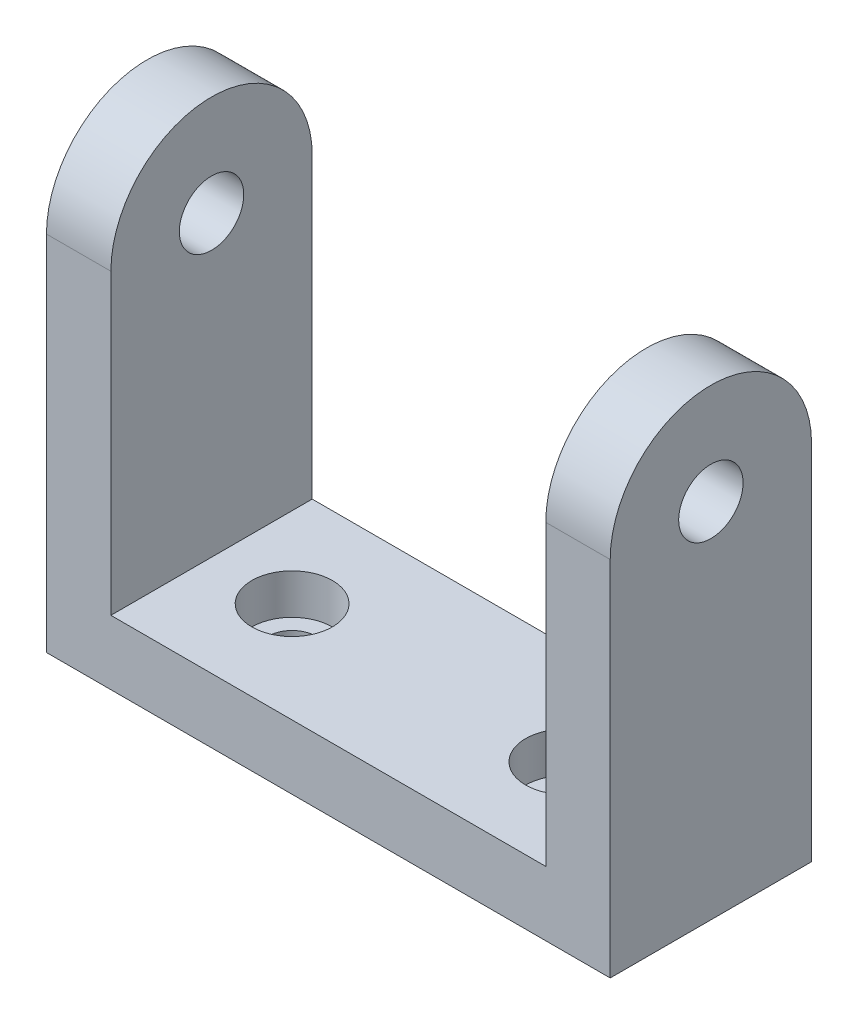
ISO-10303-21;
HEADER;
FILE_DESCRIPTION(('STEP AP214'),'2;1');
FILE_NAME('part.step','',(''),(''),'','','');
FILE_SCHEMA(('AUTOMOTIVE_DESIGN { 1 0 10303 214 1 1 1 1 }'));
ENDSEC;
DATA;
#1=APPLICATION_CONTEXT('core data for automotive mechanical design processes');
#2=APPLICATION_PROTOCOL_DEFINITION('international standard','automotive_design',2000,#1);
#3=PRODUCT_CONTEXT('',#1,'mechanical');
#4=PRODUCT('Part','Part','',(#3));
#5=PRODUCT_RELATED_PRODUCT_CATEGORY('part','',(#4));
#6=PRODUCT_DEFINITION_FORMATION('','',#4);
#7=PRODUCT_DEFINITION_CONTEXT('part definition',#1,'design');
#8=PRODUCT_DEFINITION('design','',#6,#7);
#9=PRODUCT_DEFINITION_SHAPE('','',#8);
#10=(LENGTH_UNIT() NAMED_UNIT(*) SI_UNIT(.MILLI.,.METRE.));
#11=(NAMED_UNIT(*) PLANE_ANGLE_UNIT() SI_UNIT($,.RADIAN.));
#12=(NAMED_UNIT(*) SI_UNIT($,.STERADIAN.) SOLID_ANGLE_UNIT());
#13=UNCERTAINTY_MEASURE_WITH_UNIT(LENGTH_MEASURE(1.E-05),#10,'distance_accuracy_value','');
#14=(GEOMETRIC_REPRESENTATION_CONTEXT(3) GLOBAL_UNCERTAINTY_ASSIGNED_CONTEXT((#13)) GLOBAL_UNIT_ASSIGNED_CONTEXT((#10,
#11,#12)) REPRESENTATION_CONTEXT('',''));
#15=CARTESIAN_POINT('',(0.,0.,0.));
#16=DIRECTION('',(0.,0.,1.));
#17=DIRECTION('',(1.,0.,0.));
#18=AXIS2_PLACEMENT_3D('',#15,#16,#17);
#19=CARTESIAN_POINT('',(27.,0.,12.5));
#20=DIRECTION('',(0.,-1.,0.));
#21=DIRECTION('',(1.,0.,0.));
#22=AXIS2_PLACEMENT_3D('',#19,#20,#21);
#23=PLANE('',#22);
#24=DIRECTION('',(-1.,0.,0.));
#25=VECTOR('',#24,1.);
#26=CARTESIAN_POINT('',(27.,0.,-12.5));
#27=LINE('',#26,#25);
#28=CARTESIAN_POINT('',(27.,0.,-12.5));
#29=VERTEX_POINT('',#28);
#30=CARTESIAN_POINT('',(-27.,0.,-12.5));
#31=VERTEX_POINT('',#30);
#32=EDGE_CURVE('E151',#29,#31,#27,.T.);
#33=ORIENTED_EDGE('',*,*,#32,.T.);
#34=DIRECTION('',(0.,0.,-1.));
#35=VECTOR('',#34,1.);
#36=CARTESIAN_POINT('',(-27.,0.,12.5));
#37=LINE('',#36,#35);
#38=CARTESIAN_POINT('',(-27.,0.,12.5));
#39=VERTEX_POINT('',#38);
#40=EDGE_CURVE('E139',#39,#31,#37,.T.);
#41=ORIENTED_EDGE('',*,*,#40,.F.);
#42=DIRECTION('',(-1.,0.,0.));
#43=VECTOR('',#42,1.);
#44=CARTESIAN_POINT('',(27.,0.,12.5));
#45=LINE('',#44,#43);
#46=CARTESIAN_POINT('',(27.,0.,12.5));
#47=VERTEX_POINT('',#46);
#48=EDGE_CURVE('E137',#47,#39,#45,.T.);
#49=ORIENTED_EDGE('',*,*,#48,.F.);
#50=DIRECTION('',(0.,0.,-1.));
#51=VECTOR('',#50,1.);
#52=CARTESIAN_POINT('',(27.,0.,12.5));
#53=LINE('',#52,#51);
#54=EDGE_CURVE('E155',#47,#29,#53,.T.);
#55=ORIENTED_EDGE('',*,*,#54,.T.);
#56=EDGE_LOOP('',(#33,#41,#49,#55));
#57=FACE_BOUND('',#56,.T.);
#58=CARTESIAN_POINT('',(-17.,0.,0.));
#59=DIRECTION('',(0.,1.,0.));
#60=DIRECTION('',(-1.,0.,0.));
#61=AXIS2_PLACEMENT_3D('',#58,#59,#60);
#62=CIRCLE('',#61,5.);
#63=CARTESIAN_POINT('',(-22.,0.,0.));
#64=VERTEX_POINT('',#63);
#65=EDGE_CURVE('E190',#64,#64,#62,.T.);
#66=ORIENTED_EDGE('',*,*,#65,.F.);
#67=EDGE_LOOP('',(#66));
#68=FACE_BOUND('',#67,.T.);
#69=CARTESIAN_POINT('',(17.,0.,0.));
#70=DIRECTION('',(0.,-1.,0.));
#71=DIRECTION('',(1.,0.,0.));
#72=AXIS2_PLACEMENT_3D('',#69,#70,#71);
#73=CIRCLE('',#72,5.);
#74=CARTESIAN_POINT('',(22.,0.,0.));
#75=VERTEX_POINT('',#74);
#76=EDGE_CURVE('E185',#75,#75,#73,.T.);
#77=ORIENTED_EDGE('',*,*,#76,.T.);
#78=EDGE_LOOP('',(#77));
#79=FACE_BOUND('',#78,.T.);
#80=ADVANCED_FACE('F39',(#57,#68,#79),#23,.F.);
#81=CARTESIAN_POINT('',(-17.,-8.00000000000004,0.));
#82=DIRECTION('',(0.,1.,0.));
#83=DIRECTION('',(-1.,0.,0.));
#84=AXIS2_PLACEMENT_3D('',#81,#82,#83);
#85=CYLINDRICAL_SURFACE('',#84,3.);
#86=CARTESIAN_POINT('',(-17.,-8.00000000000004,0.));
#87=DIRECTION('',(0.,1.,0.));
#88=DIRECTION('',(-1.,0.,0.));
#89=AXIS2_PLACEMENT_3D('',#86,#87,#88);
#90=CIRCLE('',#89,3.);
#91=CARTESIAN_POINT('',(-20.,-8.00000000000004,0.));
#92=VERTEX_POINT('',#91);
#93=EDGE_CURVE('E198',#92,#92,#90,.T.);
#94=ORIENTED_EDGE('',*,*,#93,.F.);
#95=EDGE_LOOP('',(#94));
#96=FACE_BOUND('',#95,.T.);
#97=CARTESIAN_POINT('',(-17.,-5.,0.));
#98=DIRECTION('',(0.,1.,0.));
#99=DIRECTION('',(-1.,0.,0.));
#100=AXIS2_PLACEMENT_3D('',#97,#98,#99);
#101=CIRCLE('',#100,3.);
#102=CARTESIAN_POINT('',(-20.,-5.,0.));
#103=VERTEX_POINT('',#102);
#104=EDGE_CURVE('E177',#103,#103,#101,.F.);
#105=ORIENTED_EDGE('',*,*,#104,.F.);
#106=EDGE_LOOP('',(#105));
#107=FACE_BOUND('',#106,.T.);
#108=ADVANCED_FACE('F234',(#96,#107),#85,.F.);
#109=CARTESIAN_POINT('',(-35.,-8.00000000000003,12.5));
#110=DIRECTION('',(0.,1.,0.));
#111=DIRECTION('',(-1.,0.,0.));
#112=AXIS2_PLACEMENT_3D('',#109,#110,#111);
#113=PLANE('',#112);
#114=DIRECTION('',(1.,0.,0.));
#115=VECTOR('',#114,1.);
#116=CARTESIAN_POINT('',(-35.,-8.00000000000003,-12.5));
#117=LINE('',#116,#115);
#118=CARTESIAN_POINT('',(-35.,-8.00000000000003,-12.5));
#119=VERTEX_POINT('',#118);
#120=CARTESIAN_POINT('',(35.,-8.00000000000002,-12.5));
#121=VERTEX_POINT('',#120);
#122=EDGE_CURVE('E145',#119,#121,#117,.T.);
#123=ORIENTED_EDGE('',*,*,#122,.T.);
#124=DIRECTION('',(0.,0.,-1.));
#125=VECTOR('',#124,1.);
#126=CARTESIAN_POINT('',(35.,-8.00000000000002,12.5));
#127=LINE('',#126,#125);
#128=CARTESIAN_POINT('',(35.,-8.00000000000002,12.5));
#129=VERTEX_POINT('',#128);
#130=EDGE_CURVE('E125',#129,#121,#127,.T.);
#131=ORIENTED_EDGE('',*,*,#130,.F.);
#132=DIRECTION('',(1.,0.,0.));
#133=VECTOR('',#132,1.);
#134=CARTESIAN_POINT('',(-35.,-8.00000000000003,12.5));
#135=LINE('',#134,#133);
#136=CARTESIAN_POINT('',(-35.,-8.00000000000003,12.5));
#137=VERTEX_POINT('',#136);
#138=EDGE_CURVE('E110',#137,#129,#135,.T.);
#139=ORIENTED_EDGE('',*,*,#138,.F.);
#140=DIRECTION('',(0.,0.,-1.));
#141=VECTOR('',#140,1.);
#142=CARTESIAN_POINT('',(-35.,-8.00000000000003,12.5));
#143=LINE('',#142,#141);
#144=EDGE_CURVE('E119',#137,#119,#143,.T.);
#145=ORIENTED_EDGE('',*,*,#144,.T.);
#146=EDGE_LOOP('',(#123,#131,#139,#145));
#147=FACE_BOUND('',#146,.T.);
#148=CARTESIAN_POINT('',(17.,-8.00000000000004,0.));
#149=DIRECTION('',(0.,-1.,0.));
#150=DIRECTION('',(1.,0.,0.));
#151=AXIS2_PLACEMENT_3D('',#148,#149,#150);
#152=CIRCLE('',#151,3.);
#153=CARTESIAN_POINT('',(20.,-8.00000000000004,0.));
#154=VERTEX_POINT('',#153);
#155=EDGE_CURVE('E183',#154,#154,#152,.T.);
#156=ORIENTED_EDGE('',*,*,#155,.F.);
#157=EDGE_LOOP('',(#156));
#158=FACE_BOUND('',#157,.T.);
#159=ORIENTED_EDGE('',*,*,#93,.T.);
#160=EDGE_LOOP('',(#159));
#161=FACE_BOUND('',#160,.T.);
#162=ADVANCED_FACE('F127',(#147,#158,#161),#113,.F.);
#163=CARTESIAN_POINT('',(27.,37.,0.));
#164=DIRECTION('',(-1.,0.,0.));
#165=DIRECTION('',(0.,0.,1.));
#166=AXIS2_PLACEMENT_3D('',#163,#164,#165);
#167=CYLINDRICAL_SURFACE('',#166,12.5);
#168=DIRECTION('',(-1.,0.,0.));
#169=VECTOR('',#168,1.);
#170=CARTESIAN_POINT('',(0.,37.,-12.5));
#171=LINE('',#170,#169);
#172=CARTESIAN_POINT('',(27.,37.,-12.5));
#173=VERTEX_POINT('',#172);
#174=CARTESIAN_POINT('',(35.,37.,-12.5));
#175=VERTEX_POINT('',#174);
#176=EDGE_CURVE('E167',#173,#175,#171,.F.);
#177=ORIENTED_EDGE('',*,*,#176,.F.);
#178=CARTESIAN_POINT('',(27.,37.,0.));
#179=DIRECTION('',(1.,0.,0.));
#180=DIRECTION('',(0.,1.,0.));
#181=AXIS2_PLACEMENT_3D('',#178,#179,#180);
#182=CIRCLE('',#181,12.5);
#183=CARTESIAN_POINT('',(27.,37.,12.5));
#184=VERTEX_POINT('',#183);
#185=EDGE_CURVE('E49',#184,#173,#182,.F.);
#186=ORIENTED_EDGE('',*,*,#185,.F.);
#187=DIRECTION('',(1.,0.,0.));
#188=VECTOR('',#187,1.);
#189=CARTESIAN_POINT('',(27.,37.,12.5));
#190=LINE('',#189,#188);
#191=CARTESIAN_POINT('',(35.,37.,12.5));
#192=VERTEX_POINT('',#191);
#193=EDGE_CURVE('E170',#192,#184,#190,.F.);
#194=ORIENTED_EDGE('',*,*,#193,.F.);
#195=CARTESIAN_POINT('',(35.,37.,0.));
#196=DIRECTION('',(-1.,0.,0.));
#197=DIRECTION('',(0.,-1.,0.));
#198=AXIS2_PLACEMENT_3D('',#195,#196,#197);
#199=CIRCLE('',#198,12.5);
#200=EDGE_CURVE('E11',#175,#192,#199,.F.);
#201=ORIENTED_EDGE('',*,*,#200,.F.);
#202=EDGE_LOOP('',(#177,#186,#194,#201));
#203=FACE_BOUND('',#202,.T.);
#204=ADVANCED_FACE('F42',(#203),#167,.T.);
#205=CARTESIAN_POINT('',(-27.,37.,0.));
#206=DIRECTION('',(-1.,0.,0.));
#207=DIRECTION('',(0.,0.,1.));
#208=AXIS2_PLACEMENT_3D('',#205,#206,#207);
#209=CYLINDRICAL_SURFACE('',#208,12.5);
#210=DIRECTION('',(1.,0.,0.));
#211=VECTOR('',#210,1.);
#212=CARTESIAN_POINT('',(-27.,37.,12.5));
#213=LINE('',#212,#211);
#214=CARTESIAN_POINT('',(-27.,37.,12.5));
#215=VERTEX_POINT('',#214);
#216=CARTESIAN_POINT('',(-35.,37.,12.5));
#217=VERTEX_POINT('',#216);
#218=EDGE_CURVE('E114',#215,#217,#213,.F.);
#219=ORIENTED_EDGE('',*,*,#218,.F.);
#220=CARTESIAN_POINT('',(-27.,37.,0.));
#221=DIRECTION('',(-1.,0.,0.));
#222=DIRECTION('',(0.,-1.,0.));
#223=AXIS2_PLACEMENT_3D('',#220,#221,#222);
#224=CIRCLE('',#223,12.5);
#225=CARTESIAN_POINT('',(-27.,37.,-12.5));
#226=VERTEX_POINT('',#225);
#227=EDGE_CURVE('E163',#226,#215,#224,.F.);
#228=ORIENTED_EDGE('',*,*,#227,.F.);
#229=DIRECTION('',(-1.,0.,0.));
#230=VECTOR('',#229,1.);
#231=CARTESIAN_POINT('',(0.,37.,-12.5));
#232=LINE('',#231,#230);
#233=CARTESIAN_POINT('',(-35.,37.,-12.5));
#234=VERTEX_POINT('',#233);
#235=EDGE_CURVE('E160',#234,#226,#232,.F.);
#236=ORIENTED_EDGE('',*,*,#235,.F.);
#237=CARTESIAN_POINT('',(-35.,37.,0.));
#238=DIRECTION('',(1.,0.,0.));
#239=DIRECTION('',(0.,1.,0.));
#240=AXIS2_PLACEMENT_3D('',#237,#238,#239);
#241=CIRCLE('',#240,12.5);
#242=EDGE_CURVE('E165',#217,#234,#241,.F.);
#243=ORIENTED_EDGE('',*,*,#242,.F.);
#244=EDGE_LOOP('',(#219,#228,#236,#243));
#245=FACE_BOUND('',#244,.T.);
#246=ADVANCED_FACE('F216',(#245),#209,.T.);
#247=CARTESIAN_POINT('',(-27.,0.,12.5));
#248=DIRECTION('',(-1.,0.,0.));
#249=DIRECTION('',(0.,-1.,0.));
#250=AXIS2_PLACEMENT_3D('',#247,#248,#249);
#251=PLANE('',#250);
#252=CARTESIAN_POINT('',(-27.,37.,0.));
#253=DIRECTION('',(-1.,0.,0.));
#254=DIRECTION('',(0.,-1.,0.));
#255=AXIS2_PLACEMENT_3D('',#252,#253,#254);
#256=CIRCLE('',#255,4.);
#257=CARTESIAN_POINT('',(-27.,33.,0.));
#258=VERTEX_POINT('',#257);
#259=EDGE_CURVE('E143',#258,#258,#256,.T.);
#260=ORIENTED_EDGE('',*,*,#259,.T.);
#261=EDGE_LOOP('',(#260));
#262=FACE_BOUND('',#261,.T.);
#263=DIRECTION('',(0.,1.,0.));
#264=VECTOR('',#263,1.);
#265=CARTESIAN_POINT('',(-27.,0.,-12.5));
#266=LINE('',#265,#264);
#267=EDGE_CURVE('E140',#31,#226,#266,.T.);
#268=ORIENTED_EDGE('',*,*,#267,.T.);
#269=ORIENTED_EDGE('',*,*,#227,.T.);
#270=DIRECTION('',(0.,1.,0.));
#271=VECTOR('',#270,1.);
#272=CARTESIAN_POINT('',(-27.,0.,12.5));
#273=LINE('',#272,#271);
#274=EDGE_CURVE('E116',#39,#215,#273,.T.);
#275=ORIENTED_EDGE('',*,*,#274,.F.);
#276=ORIENTED_EDGE('',*,*,#40,.T.);
#277=EDGE_LOOP('',(#268,#269,#275,#276));
#278=FACE_BOUND('',#277,.T.);
#279=ADVANCED_FACE('F212',(#262,#278),#251,.F.);
#280=CARTESIAN_POINT('',(-35.,49.5,12.5));
#281=DIRECTION('',(1.,0.,0.));
#282=DIRECTION('',(0.,1.,0.));
#283=AXIS2_PLACEMENT_3D('',#280,#281,#282);
#284=PLANE('',#283);
#285=CARTESIAN_POINT('',(-35.,37.,0.));
#286=DIRECTION('',(1.,0.,0.));
#287=DIRECTION('',(0.,1.,0.));
#288=AXIS2_PLACEMENT_3D('',#285,#286,#287);
#289=CIRCLE('',#288,4.);
#290=CARTESIAN_POINT('',(-35.,41.,0.));
#291=VERTEX_POINT('',#290);
#292=EDGE_CURVE('E175',#291,#291,#289,.T.);
#293=ORIENTED_EDGE('',*,*,#292,.T.);
#294=EDGE_LOOP('',(#293));
#295=FACE_BOUND('',#294,.T.);
#296=DIRECTION('',(0.,-1.,0.));
#297=VECTOR('',#296,1.);
#298=CARTESIAN_POINT('',(-35.,49.5,12.5));
#299=LINE('',#298,#297);
#300=EDGE_CURVE('E105',#217,#137,#299,.T.);
#301=ORIENTED_EDGE('',*,*,#300,.F.);
#302=ORIENTED_EDGE('',*,*,#242,.T.);
#303=DIRECTION('',(0.,-1.,0.));
#304=VECTOR('',#303,1.);
#305=CARTESIAN_POINT('',(-35.,49.5,-12.5));
#306=LINE('',#305,#304);
#307=EDGE_CURVE('E122',#234,#119,#306,.T.);
#308=ORIENTED_EDGE('',*,*,#307,.T.);
#309=ORIENTED_EDGE('',*,*,#144,.F.);
#310=EDGE_LOOP('',(#301,#302,#308,#309));
#311=FACE_BOUND('',#310,.T.);
#312=ADVANCED_FACE('F120',(#295,#311),#284,.F.);
#313=CARTESIAN_POINT('',(35.,49.5,12.5));
#314=DIRECTION('',(-1.,0.,0.));
#315=DIRECTION('',(0.,-1.,0.));
#316=AXIS2_PLACEMENT_3D('',#313,#314,#315);
#317=PLANE('',#316);
#318=CARTESIAN_POINT('',(35.,37.,0.));
#319=DIRECTION('',(-1.,0.,0.));
#320=DIRECTION('',(0.,-1.,0.));
#321=AXIS2_PLACEMENT_3D('',#318,#319,#320);
#322=CIRCLE('',#321,4.);
#323=CARTESIAN_POINT('',(35.,33.,0.));
#324=VERTEX_POINT('',#323);
#325=EDGE_CURVE('E176',#324,#324,#322,.T.);
#326=ORIENTED_EDGE('',*,*,#325,.T.);
#327=EDGE_LOOP('',(#326));
#328=FACE_BOUND('',#327,.T.);
#329=DIRECTION('',(0.,1.,0.));
#330=VECTOR('',#329,1.);
#331=CARTESIAN_POINT('',(35.,49.5,-12.5));
#332=LINE('',#331,#330);
#333=EDGE_CURVE('E147',#121,#175,#332,.T.);
#334=ORIENTED_EDGE('',*,*,#333,.T.);
#335=ORIENTED_EDGE('',*,*,#200,.T.);
#336=DIRECTION('',(0.,1.,0.));
#337=VECTOR('',#336,1.);
#338=CARTESIAN_POINT('',(35.,49.5,12.5));
#339=LINE('',#338,#337);
#340=EDGE_CURVE('E130',#129,#192,#339,.T.);
#341=ORIENTED_EDGE('',*,*,#340,.F.);
#342=ORIENTED_EDGE('',*,*,#130,.T.);
#343=EDGE_LOOP('',(#334,#335,#341,#342));
#344=FACE_BOUND('',#343,.T.);
#345=ADVANCED_FACE('F221',(#328,#344),#317,.F.);
#346=CARTESIAN_POINT('',(27.,0.,12.5));
#347=DIRECTION('',(1.,0.,0.));
#348=DIRECTION('',(0.,1.,0.));
#349=AXIS2_PLACEMENT_3D('',#346,#347,#348);
#350=PLANE('',#349);
#351=CARTESIAN_POINT('',(27.,37.,0.));
#352=DIRECTION('',(1.,0.,0.));
#353=DIRECTION('',(0.,1.,0.));
#354=AXIS2_PLACEMENT_3D('',#351,#352,#353);
#355=CIRCLE('',#354,4.);
#356=CARTESIAN_POINT('',(27.,41.,0.));
#357=VERTEX_POINT('',#356);
#358=EDGE_CURVE('E173',#357,#357,#355,.T.);
#359=ORIENTED_EDGE('',*,*,#358,.T.);
#360=EDGE_LOOP('',(#359));
#361=FACE_BOUND('',#360,.T.);
#362=DIRECTION('',(0.,-1.,0.));
#363=VECTOR('',#362,1.);
#364=CARTESIAN_POINT('',(27.,0.,12.5));
#365=LINE('',#364,#363);
#366=EDGE_CURVE('E132',#184,#47,#365,.T.);
#367=ORIENTED_EDGE('',*,*,#366,.F.);
#368=ORIENTED_EDGE('',*,*,#185,.T.);
#369=DIRECTION('',(0.,-1.,0.));
#370=VECTOR('',#369,1.);
#371=CARTESIAN_POINT('',(27.,0.,-12.5));
#372=LINE('',#371,#370);
#373=EDGE_CURVE('E149',#173,#29,#372,.T.);
#374=ORIENTED_EDGE('',*,*,#373,.T.);
#375=ORIENTED_EDGE('',*,*,#54,.F.);
#376=EDGE_LOOP('',(#367,#368,#374,#375));
#377=FACE_BOUND('',#376,.T.);
#378=ADVANCED_FACE('F225',(#361,#377),#350,.F.);
#379=CARTESIAN_POINT('',(0.,0.,12.5));
#380=DIRECTION('',(0.,0.,1.));
#381=DIRECTION('',(1.,0.,0.));
#382=AXIS2_PLACEMENT_3D('',#379,#380,#381);
#383=PLANE('',#382);
#384=ORIENTED_EDGE('',*,*,#340,.T.);
#385=ORIENTED_EDGE('',*,*,#193,.T.);
#386=ORIENTED_EDGE('',*,*,#366,.T.);
#387=ORIENTED_EDGE('',*,*,#48,.T.);
#388=ORIENTED_EDGE('',*,*,#274,.T.);
#389=ORIENTED_EDGE('',*,*,#218,.T.);
#390=ORIENTED_EDGE('',*,*,#300,.T.);
#391=ORIENTED_EDGE('',*,*,#138,.T.);
#392=EDGE_LOOP('',(#384,#385,#386,#387,#388,#389,#390,#391));
#393=FACE_BOUND('',#392,.T.);
#394=ADVANCED_FACE('F108',(#393),#383,.T.);
#395=CARTESIAN_POINT('',(0.,0.,-12.5));
#396=DIRECTION('',(0.,0.,1.));
#397=DIRECTION('',(1.,0.,0.));
#398=AXIS2_PLACEMENT_3D('',#395,#396,#397);
#399=PLANE('',#398);
#400=ORIENTED_EDGE('',*,*,#373,.F.);
#401=ORIENTED_EDGE('',*,*,#176,.T.);
#402=ORIENTED_EDGE('',*,*,#333,.F.);
#403=ORIENTED_EDGE('',*,*,#122,.F.);
#404=ORIENTED_EDGE('',*,*,#307,.F.);
#405=ORIENTED_EDGE('',*,*,#235,.T.);
#406=ORIENTED_EDGE('',*,*,#267,.F.);
#407=ORIENTED_EDGE('',*,*,#32,.F.);
#408=EDGE_LOOP('',(#400,#401,#402,#403,#404,#405,#406,#407));
#409=FACE_BOUND('',#408,.T.);
#410=ADVANCED_FACE('F219',(#409),#399,.F.);
#411=CARTESIAN_POINT('',(35.,37.,0.));
#412=DIRECTION('',(-1.,0.,0.));
#413=DIRECTION('',(0.,-1.,0.));
#414=AXIS2_PLACEMENT_3D('',#411,#412,#413);
#415=CYLINDRICAL_SURFACE('',#414,4.);
#416=ORIENTED_EDGE('',*,*,#325,.F.);
#417=EDGE_LOOP('',(#416));
#418=FACE_BOUND('',#417,.T.);
#419=ORIENTED_EDGE('',*,*,#358,.F.);
#420=EDGE_LOOP('',(#419));
#421=FACE_BOUND('',#420,.T.);
#422=ADVANCED_FACE('F269',(#418,#421),#415,.F.);
#423=ORIENTED_EDGE('',*,*,#292,.F.);
#424=EDGE_LOOP('',(#423));
#425=FACE_BOUND('',#424,.T.);
#426=ORIENTED_EDGE('',*,*,#259,.F.);
#427=EDGE_LOOP('',(#426));
#428=FACE_BOUND('',#427,.T.);
#429=ADVANCED_FACE('F266',(#425,#428),#415,.F.);
#430=CARTESIAN_POINT('',(17.,-8.00000000000004,0.));
#431=DIRECTION('',(0.,1.,0.));
#432=DIRECTION('',(-1.,0.,0.));
#433=AXIS2_PLACEMENT_3D('',#430,#431,#432);
#434=CYLINDRICAL_SURFACE('',#433,3.);
#435=CARTESIAN_POINT('',(17.,-5.,0.));
#436=DIRECTION('',(0.,-1.,0.));
#437=DIRECTION('',(1.,0.,0.));
#438=AXIS2_PLACEMENT_3D('',#435,#436,#437);
#439=CIRCLE('',#438,3.);
#440=CARTESIAN_POINT('',(20.,-5.,0.));
#441=VERTEX_POINT('',#440);
#442=EDGE_CURVE('E44',#441,#441,#439,.T.);
#443=ORIENTED_EDGE('',*,*,#442,.F.);
#444=EDGE_LOOP('',(#443));
#445=FACE_BOUND('',#444,.T.);
#446=ORIENTED_EDGE('',*,*,#155,.T.);
#447=EDGE_LOOP('',(#446));
#448=FACE_BOUND('',#447,.T.);
#449=ADVANCED_FACE('F268',(#445,#448),#434,.F.);
#450=CARTESIAN_POINT('',(-17.,-5.,0.));
#451=DIRECTION('',(0.,1.,0.));
#452=DIRECTION('',(-1.,0.,0.));
#453=AXIS2_PLACEMENT_3D('',#450,#451,#452);
#454=PLANE('',#453);
#455=CARTESIAN_POINT('',(-17.,-5.,0.));
#456=DIRECTION('',(0.,1.,0.));
#457=DIRECTION('',(-1.,0.,0.));
#458=AXIS2_PLACEMENT_3D('',#455,#456,#457);
#459=CIRCLE('',#458,5.);
#460=CARTESIAN_POINT('',(-22.,-5.,0.));
#461=VERTEX_POINT('',#460);
#462=EDGE_CURVE('E195',#461,#461,#459,.T.);
#463=ORIENTED_EDGE('',*,*,#462,.T.);
#464=EDGE_LOOP('',(#463));
#465=FACE_BOUND('',#464,.T.);
#466=ORIENTED_EDGE('',*,*,#104,.T.);
#467=EDGE_LOOP('',(#466));
#468=FACE_BOUND('',#467,.T.);
#469=ADVANCED_FACE('F276',(#465,#468),#454,.T.);
#470=CARTESIAN_POINT('',(-17.,-5.,0.));
#471=DIRECTION('',(0.,1.,0.));
#472=DIRECTION('',(-1.,0.,0.));
#473=AXIS2_PLACEMENT_3D('',#470,#471,#472);
#474=CYLINDRICAL_SURFACE('',#473,5.);
#475=ORIENTED_EDGE('',*,*,#462,.F.);
#476=EDGE_LOOP('',(#475));
#477=FACE_BOUND('',#476,.T.);
#478=ORIENTED_EDGE('',*,*,#65,.T.);
#479=EDGE_LOOP('',(#478));
#480=FACE_BOUND('',#479,.T.);
#481=ADVANCED_FACE('F331',(#477,#480),#474,.F.);
#482=CARTESIAN_POINT('',(17.,-5.,0.));
#483=DIRECTION('',(0.,1.,0.));
#484=DIRECTION('',(-1.,0.,0.));
#485=AXIS2_PLACEMENT_3D('',#482,#483,#484);
#486=CYLINDRICAL_SURFACE('',#485,5.);
#487=CARTESIAN_POINT('',(17.,-5.,0.));
#488=DIRECTION('',(0.,-1.,0.));
#489=DIRECTION('',(1.,0.,0.));
#490=AXIS2_PLACEMENT_3D('',#487,#488,#489);
#491=CIRCLE('',#490,5.);
#492=CARTESIAN_POINT('',(22.,-5.,0.));
#493=VERTEX_POINT('',#492);
#494=EDGE_CURVE('E179',#493,#493,#491,.T.);
#495=ORIENTED_EDGE('',*,*,#494,.T.);
#496=EDGE_LOOP('',(#495));
#497=FACE_BOUND('',#496,.T.);
#498=ORIENTED_EDGE('',*,*,#76,.F.);
#499=EDGE_LOOP('',(#498));
#500=FACE_BOUND('',#499,.T.);
#501=ADVANCED_FACE('F341',(#497,#500),#486,.F.);
#502=CARTESIAN_POINT('',(17.,-5.,0.));
#503=DIRECTION('',(0.,-1.,0.));
#504=DIRECTION('',(1.,0.,0.));
#505=AXIS2_PLACEMENT_3D('',#502,#503,#504);
#506=PLANE('',#505);
#507=ORIENTED_EDGE('',*,*,#442,.T.);
#508=EDGE_LOOP('',(#507));
#509=FACE_BOUND('',#508,.T.);
#510=ORIENTED_EDGE('',*,*,#494,.F.);
#511=EDGE_LOOP('',(#510));
#512=FACE_BOUND('',#511,.T.);
#513=ADVANCED_FACE('F351',(#509,#512),#506,.F.);
#514=CLOSED_SHELL('',(#80,#108,#162,#204,#246,#279,#312,#345,#378,#394,#410,#422,#429,#449,#469,
#481,#501,#513));
#515=MANIFOLD_SOLID_BREP('B2',#514);
#516=ADVANCED_BREP_SHAPE_REPRESENTATION('',(#18,#515),#14);
#517=SHAPE_DEFINITION_REPRESENTATION(#9,#516);
ENDSEC;
END-ISO-10303-21;
